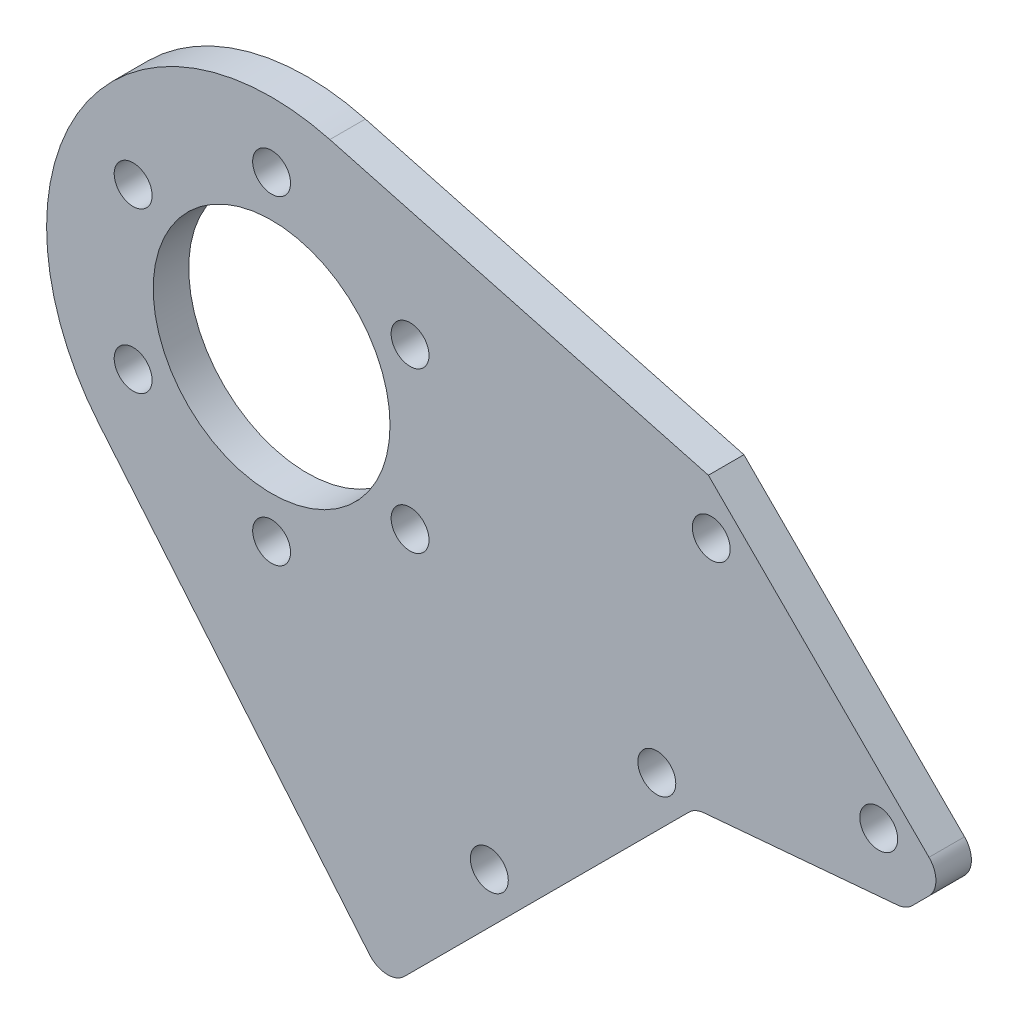
ISO-10303-21;
HEADER;
FILE_DESCRIPTION(('STEP AP214'),'2;1');
FILE_NAME('part.step','',(''),(''),'','','');
FILE_SCHEMA(('AUTOMOTIVE_DESIGN { 1 0 10303 214 1 1 1 1 }'));
ENDSEC;
DATA;
#1=APPLICATION_CONTEXT('core data for automotive mechanical design processes');
#2=APPLICATION_PROTOCOL_DEFINITION('international standard','automotive_design',2000,#1);
#3=PRODUCT_CONTEXT('',#1,'mechanical');
#4=PRODUCT('Part','Part','',(#3));
#5=PRODUCT_RELATED_PRODUCT_CATEGORY('part','',(#4));
#6=PRODUCT_DEFINITION_FORMATION('','',#4);
#7=PRODUCT_DEFINITION_CONTEXT('part definition',#1,'design');
#8=PRODUCT_DEFINITION('design','',#6,#7);
#9=PRODUCT_DEFINITION_SHAPE('','',#8);
#10=(LENGTH_UNIT() NAMED_UNIT(*) SI_UNIT(.MILLI.,.METRE.));
#11=(NAMED_UNIT(*) PLANE_ANGLE_UNIT() SI_UNIT($,.RADIAN.));
#12=(NAMED_UNIT(*) SI_UNIT($,.STERADIAN.) SOLID_ANGLE_UNIT());
#13=UNCERTAINTY_MEASURE_WITH_UNIT(LENGTH_MEASURE(1.E-05),#10,'distance_accuracy_value','');
#14=(GEOMETRIC_REPRESENTATION_CONTEXT(3) GLOBAL_UNCERTAINTY_ASSIGNED_CONTEXT((#13)) GLOBAL_UNIT_ASSIGNED_CONTEXT((#10,
#11,#12)) REPRESENTATION_CONTEXT('',''));
#15=CARTESIAN_POINT('',(0.,0.,0.));
#16=DIRECTION('',(0.,0.,1.));
#17=DIRECTION('',(1.,0.,0.));
#18=AXIS2_PLACEMENT_3D('',#15,#16,#17);
#19=CARTESIAN_POINT('',(0.,0.,3.));
#20=DIRECTION('',(0.,0.,1.));
#21=DIRECTION('',(1.,0.,0.));
#22=AXIS2_PLACEMENT_3D('',#19,#20,#21);
#23=PLANE('',#22);
#24=DIRECTION('',(0.965925826289065,-0.258819045102532,0.));
#25=VECTOR('',#24,1.);
#26=CARTESIAN_POINT('',(4.91756185694811,18.3525906994922,3.));
#27=LINE('',#26,#25);
#28=CARTESIAN_POINT('',(4.91756185694811,18.3525906994923,3.));
#29=VERTEX_POINT('',#28);
#30=CARTESIAN_POINT('',(36.8810468499901,9.78800070832194,3.));
#31=VERTEX_POINT('',#30);
#32=EDGE_CURVE('E121',#29,#31,#27,.T.);
#33=ORIENTED_EDGE('',*,*,#32,.F.);
#34=CARTESIAN_POINT('',(0.,0.,3.));
#35=DIRECTION('',(0.,0.,1.));
#36=DIRECTION('',(1.,0.,0.));
#37=AXIS2_PLACEMENT_3D('',#34,#35,#36);
#38=CIRCLE('',#37,19.);
#39=CARTESIAN_POINT('',(-14.5902375303274,-12.1706601632215,3.));
#40=VERTEX_POINT('',#39);
#41=EDGE_CURVE('E11',#29,#40,#38,.T.);
#42=ORIENTED_EDGE('',*,*,#41,.T.);
#43=DIRECTION('',(0.640561061222182,-0.767907238438284,0.));
#44=VECTOR('',#43,1.);
#45=CARTESIAN_POINT('',(8.26225110529954,-39.5663176609533,3.));
#46=LINE('',#45,#44);
#47=CARTESIAN_POINT('',(8.26225110529954,-39.5663176609533,3.));
#48=VERTEX_POINT('',#47);
#49=EDGE_CURVE('E144',#40,#48,#46,.T.);
#50=ORIENTED_EDGE('',*,*,#49,.T.);
#51=CARTESIAN_POINT('',(9.7980655821761,-38.285195538509,3.));
#52=DIRECTION('',(0.,0.,1.));
#53=DIRECTION('',(-1.,0.,0.));
#54=AXIS2_PLACEMENT_3D('',#51,#52,#53);
#55=CIRCLE('',#54,2.);
#56=CARTESIAN_POINT('',(11.2122791445492,-39.6994091008821,3.));
#57=VERTEX_POINT('',#56);
#58=EDGE_CURVE('E149',#48,#57,#55,.T.);
#59=ORIENTED_EDGE('',*,*,#58,.T.);
#60=DIRECTION('',(0.707106781186551,0.707106781186544,0.));
#61=VECTOR('',#60,1.);
#62=CARTESIAN_POINT('',(11.2122791445492,-39.6994091008821,3.));
#63=LINE('',#62,#61);
#64=CARTESIAN_POINT('',(35.2414614554186,-15.6702267900129,3.));
#65=VERTEX_POINT('',#64);
#66=EDGE_CURVE('E151',#57,#65,#63,.T.);
#67=ORIENTED_EDGE('',*,*,#66,.T.);
#68=CARTESIAN_POINT('',(36.6556750177917,-17.084440352386,3.));
#69=DIRECTION('',(0.,0.,-1.));
#70=DIRECTION('',(-1.,0.,0.));
#71=AXIS2_PLACEMENT_3D('',#68,#69,#70);
#72=CIRCLE('',#71,1.99999999999999);
#73=CARTESIAN_POINT('',(36.4813635322964,-15.0920509562025,3.));
#74=VERTEX_POINT('',#73);
#75=EDGE_CURVE('E159',#65,#74,#72,.T.);
#76=ORIENTED_EDGE('',*,*,#75,.T.);
#77=DIRECTION('',(0.996194698091746,0.0871557427476521,0.));
#78=VECTOR('',#77,1.);
#79=CARTESIAN_POINT('',(36.4813635322964,-15.0920509562025,3.));
#80=LINE('',#79,#78);
#81=CARTESIAN_POINT('',(52.853766683893,-13.6596512857618,3.));
#82=VERTEX_POINT('',#81);
#83=EDGE_CURVE('E162',#74,#82,#80,.T.);
#84=ORIENTED_EDGE('',*,*,#83,.T.);
#85=CARTESIAN_POINT('',(52.6794551983977,-11.6672618895783,3.));
#86=DIRECTION('',(0.,0.,1.));
#87=DIRECTION('',(-1.,0.,0.));
#88=AXIS2_PLACEMENT_3D('',#85,#86,#87);
#89=CIRCLE('',#88,2.);
#90=CARTESIAN_POINT('',(54.0936687607708,-13.0814754519514,3.));
#91=VERTEX_POINT('',#90);
#92=EDGE_CURVE('E165',#82,#91,#89,.T.);
#93=ORIENTED_EDGE('',*,*,#92,.T.);
#94=DIRECTION('',(0.707106781186551,0.707106781186544,0.));
#95=VECTOR('',#94,1.);
#96=CARTESIAN_POINT('',(55.5078823231439,-11.6672618895783,3.));
#97=LINE('',#96,#95);
#98=CARTESIAN_POINT('',(55.5078823231439,-11.6672618895783,3.));
#99=VERTEX_POINT('',#98);
#100=EDGE_CURVE('E168',#91,#99,#97,.T.);
#101=ORIENTED_EDGE('',*,*,#100,.T.);
#102=CARTESIAN_POINT('',(54.0936687607708,-10.2530483272052,3.));
#103=DIRECTION('',(0.,0.,1.));
#104=DIRECTION('',(-1.,0.,0.));
#105=AXIS2_PLACEMENT_3D('',#102,#103,#104);
#106=CIRCLE('',#105,2.);
#107=CARTESIAN_POINT('',(55.5078823231439,-8.83883476483214,3.));
#108=VERTEX_POINT('',#107);
#109=EDGE_CURVE('E153',#99,#108,#106,.T.);
#110=ORIENTED_EDGE('',*,*,#109,.T.);
#111=DIRECTION('',(-0.707106781186544,0.707106781186551,0.));
#112=VECTOR('',#111,1.);
#113=CARTESIAN_POINT('',(24.7487373415293,21.9203102167828,3.));
#114=LINE('',#113,#112);
#115=EDGE_CURVE('E126',#108,#31,#114,.T.);
#116=ORIENTED_EDGE('',*,*,#115,.T.);
#117=EDGE_LOOP('',(#33,#42,#50,#59,#67,#76,#84,#93,#101,#110,#116));
#118=FACE_BOUND('',#117,.T.);
#119=CARTESIAN_POINT('',(1.73860925656299E-13,-13.5,3.));
#120=DIRECTION('',(0.,0.,1.));
#121=DIRECTION('',(1.,0.,0.));
#122=AXIS2_PLACEMENT_3D('',#119,#120,#121);
#123=CIRCLE('',#122,1.6);
#124=CARTESIAN_POINT('',(1.60000000000017,-13.5,3.));
#125=VERTEX_POINT('',#124);
#126=EDGE_CURVE('E199',#125,#125,#123,.T.);
#127=ORIENTED_EDGE('',*,*,#126,.F.);
#128=EDGE_LOOP('',(#127));
#129=FACE_BOUND('',#128,.T.);
#130=CARTESIAN_POINT('',(11.6913429510899,6.75000000000004,3.));
#131=DIRECTION('',(0.,0.,1.));
#132=DIRECTION('',(1.,0.,0.));
#133=AXIS2_PLACEMENT_3D('',#130,#131,#132);
#134=CIRCLE('',#133,1.6);
#135=CARTESIAN_POINT('',(13.2913429510899,6.75000000000004,3.));
#136=VERTEX_POINT('',#135);
#137=EDGE_CURVE('E211',#136,#136,#134,.T.);
#138=ORIENTED_EDGE('',*,*,#137,.F.);
#139=EDGE_LOOP('',(#138));
#140=FACE_BOUND('',#139,.T.);
#141=CARTESIAN_POINT('',(0.,0.,3.));
#142=DIRECTION('',(0.,0.,1.));
#143=DIRECTION('',(1.,0.,0.));
#144=AXIS2_PLACEMENT_3D('',#141,#142,#143);
#145=CIRCLE('',#144,10.);
#146=CARTESIAN_POINT('',(10.,0.,3.));
#147=VERTEX_POINT('',#146);
#148=EDGE_CURVE('E223',#147,#147,#145,.T.);
#149=ORIENTED_EDGE('',*,*,#148,.F.);
#150=EDGE_LOOP('',(#149));
#151=FACE_BOUND('',#150,.T.);
#152=CARTESIAN_POINT('',(0.,13.5,3.));
#153=DIRECTION('',(0.,0.,1.));
#154=DIRECTION('',(1.,0.,0.));
#155=AXIS2_PLACEMENT_3D('',#152,#153,#154);
#156=CIRCLE('',#155,1.6);
#157=CARTESIAN_POINT('',(1.6,13.5,3.));
#158=VERTEX_POINT('',#157);
#159=EDGE_CURVE('E229',#158,#158,#156,.T.);
#160=ORIENTED_EDGE('',*,*,#159,.F.);
#161=EDGE_LOOP('',(#160));
#162=FACE_BOUND('',#161,.T.);
#163=CARTESIAN_POINT('',(-11.69134295109,-6.74999999999989,3.));
#164=DIRECTION('',(0.,0.,1.));
#165=DIRECTION('',(1.,0.,0.));
#166=AXIS2_PLACEMENT_3D('',#163,#164,#165);
#167=CIRCLE('',#166,1.6);
#168=CARTESIAN_POINT('',(-10.09134295109,-6.74999999999989,3.));
#169=VERTEX_POINT('',#168);
#170=EDGE_CURVE('E217',#169,#169,#167,.T.);
#171=ORIENTED_EDGE('',*,*,#170,.F.);
#172=EDGE_LOOP('',(#171));
#173=FACE_BOUND('',#172,.T.);
#174=CARTESIAN_POINT('',(11.6913429510899,-6.75,3.));
#175=DIRECTION('',(0.,0.,1.));
#176=DIRECTION('',(1.,0.,0.));
#177=AXIS2_PLACEMENT_3D('',#174,#175,#176);
#178=CIRCLE('',#177,1.60000000000045);
#179=CARTESIAN_POINT('',(13.2913429510904,-6.75,3.));
#180=VERTEX_POINT('',#179);
#181=EDGE_CURVE('E205',#180,#180,#178,.T.);
#182=ORIENTED_EDGE('',*,*,#181,.F.);
#183=EDGE_LOOP('',(#182));
#184=FACE_BOUND('',#183,.T.);
#185=CARTESIAN_POINT('',(-11.6913429510898,6.75000000000014,3.));
#186=DIRECTION('',(0.,0.,1.));
#187=DIRECTION('',(1.,0.,0.));
#188=AXIS2_PLACEMENT_3D('',#185,#186,#187);
#189=CIRCLE('',#188,1.6);
#190=CARTESIAN_POINT('',(-10.0913429510898,6.75000000000014,3.));
#191=VERTEX_POINT('',#190);
#192=EDGE_CURVE('E191',#191,#191,#189,.T.);
#193=ORIENTED_EDGE('',*,*,#192,.F.);
#194=EDGE_LOOP('',(#193));
#195=FACE_BOUND('',#194,.T.);
#196=CARTESIAN_POINT('',(18.38477631085,-28.2842712474621,3.));
#197=DIRECTION('',(0.,0.,1.));
#198=DIRECTION('',(1.,0.,0.));
#199=AXIS2_PLACEMENT_3D('',#196,#197,#198);
#200=CIRCLE('',#199,1.60000000000018);
#201=CARTESIAN_POINT('',(19.9847763108501,-28.2842712474621,3.));
#202=VERTEX_POINT('',#201);
#203=EDGE_CURVE('E280',#202,#202,#200,.T.);
#204=ORIENTED_EDGE('',*,*,#203,.F.);
#205=EDGE_LOOP('',(#204));
#206=FACE_BOUND('',#205,.T.);
#207=CARTESIAN_POINT('',(32.526911934581,-14.1421356237312,3.));
#208=DIRECTION('',(0.,0.,1.));
#209=DIRECTION('',(1.,0.,0.));
#210=AXIS2_PLACEMENT_3D('',#207,#208,#209);
#211=CIRCLE('',#210,1.60000000000019);
#212=CARTESIAN_POINT('',(34.1269119345812,-14.1421356237312,3.));
#213=VERTEX_POINT('',#212);
#214=EDGE_CURVE('E283',#213,#213,#211,.T.);
#215=ORIENTED_EDGE('',*,*,#214,.F.);
#216=EDGE_LOOP('',(#215));
#217=FACE_BOUND('',#216,.T.);
#218=CARTESIAN_POINT('',(37.1231060122938,5.30330085889891,3.));
#219=DIRECTION('',(0.,0.,1.));
#220=DIRECTION('',(1.,0.,0.));
#221=AXIS2_PLACEMENT_3D('',#218,#219,#220);
#222=CIRCLE('',#221,1.6);
#223=CARTESIAN_POINT('',(38.7231060122938,5.30330085889891,3.));
#224=VERTEX_POINT('',#223);
#225=EDGE_CURVE('E286',#224,#224,#222,.T.);
#226=ORIENTED_EDGE('',*,*,#225,.F.);
#227=EDGE_LOOP('',(#226));
#228=FACE_BOUND('',#227,.T.);
#229=CARTESIAN_POINT('',(51.2652416360247,-8.83883476483211,3.));
#230=DIRECTION('',(0.,0.,1.));
#231=DIRECTION('',(1.,0.,0.));
#232=AXIS2_PLACEMENT_3D('',#229,#230,#231);
#233=CIRCLE('',#232,1.59999999999998);
#234=CARTESIAN_POINT('',(52.8652416360246,-8.83883476483211,3.));
#235=VERTEX_POINT('',#234);
#236=EDGE_CURVE('E289',#235,#235,#233,.T.);
#237=ORIENTED_EDGE('',*,*,#236,.F.);
#238=EDGE_LOOP('',(#237));
#239=FACE_BOUND('',#238,.T.);
#240=ADVANCED_FACE('F41',(#118,#129,#140,#151,#162,#173,#184,#195,#206,#217,#228,#239),#23,.T.);
#241=CARTESIAN_POINT('',(0.,0.,0.));
#242=DIRECTION('',(0.,0.,1.));
#243=DIRECTION('',(1.,0.,0.));
#244=AXIS2_PLACEMENT_3D('',#241,#242,#243);
#245=PLANE('',#244);
#246=CARTESIAN_POINT('',(0.,0.,0.));
#247=DIRECTION('',(0.,0.,1.));
#248=DIRECTION('',(1.,0.,0.));
#249=AXIS2_PLACEMENT_3D('',#246,#247,#248);
#250=CIRCLE('',#249,19.);
#251=CARTESIAN_POINT('',(4.91756185694811,18.3525906994922,0.));
#252=VERTEX_POINT('',#251);
#253=CARTESIAN_POINT('',(-14.5902375303274,-12.1706601632215,0.));
#254=VERTEX_POINT('',#253);
#255=EDGE_CURVE('E45',#252,#254,#250,.T.);
#256=ORIENTED_EDGE('',*,*,#255,.F.);
#257=DIRECTION('',(0.965925826289065,-0.258819045102532,0.));
#258=VECTOR('',#257,1.);
#259=CARTESIAN_POINT('',(4.91756185694811,18.3525906994922,0.));
#260=LINE('',#259,#258);
#261=CARTESIAN_POINT('',(36.8810468499901,9.78800070832194,0.));
#262=VERTEX_POINT('',#261);
#263=EDGE_CURVE('E134',#252,#262,#260,.T.);
#264=ORIENTED_EDGE('',*,*,#263,.T.);
#265=DIRECTION('',(0.707106781186544,-0.707106781186551,0.));
#266=VECTOR('',#265,1.);
#267=CARTESIAN_POINT('',(24.7487373415293,21.9203102167828,0.));
#268=LINE('',#267,#266);
#269=CARTESIAN_POINT('',(55.5078823231439,-8.83883476483214,0.));
#270=VERTEX_POINT('',#269);
#271=EDGE_CURVE('E266',#262,#270,#268,.T.);
#272=ORIENTED_EDGE('',*,*,#271,.T.);
#273=CARTESIAN_POINT('',(54.0936687607708,-10.2530483272052,0.));
#274=DIRECTION('',(0.,0.,1.));
#275=DIRECTION('',(1.,0.,0.));
#276=AXIS2_PLACEMENT_3D('',#273,#274,#275);
#277=CIRCLE('',#276,2.);
#278=CARTESIAN_POINT('',(55.5078823231439,-11.6672618895783,0.));
#279=VERTEX_POINT('',#278);
#280=EDGE_CURVE('E278',#270,#279,#277,.F.);
#281=ORIENTED_EDGE('',*,*,#280,.T.);
#282=DIRECTION('',(-0.707106781186551,-0.707106781186544,0.));
#283=VECTOR('',#282,1.);
#284=CARTESIAN_POINT('',(55.5078823231439,-11.6672618895783,0.));
#285=LINE('',#284,#283);
#286=CARTESIAN_POINT('',(54.0936687607708,-13.0814754519514,0.));
#287=VERTEX_POINT('',#286);
#288=EDGE_CURVE('E276',#279,#287,#285,.T.);
#289=ORIENTED_EDGE('',*,*,#288,.T.);
#290=CARTESIAN_POINT('',(52.6794551983977,-11.6672618895783,0.));
#291=DIRECTION('',(0.,0.,1.));
#292=DIRECTION('',(1.,0.,0.));
#293=AXIS2_PLACEMENT_3D('',#290,#291,#292);
#294=CIRCLE('',#293,2.);
#295=CARTESIAN_POINT('',(52.853766683893,-13.6596512857618,0.));
#296=VERTEX_POINT('',#295);
#297=EDGE_CURVE('E274',#287,#296,#294,.F.);
#298=ORIENTED_EDGE('',*,*,#297,.T.);
#299=DIRECTION('',(-0.996194698091746,-0.0871557427476521,0.));
#300=VECTOR('',#299,1.);
#301=CARTESIAN_POINT('',(36.4813635322964,-15.0920509562025,0.));
#302=LINE('',#301,#300);
#303=CARTESIAN_POINT('',(36.4813635322964,-15.0920509562025,0.));
#304=VERTEX_POINT('',#303);
#305=EDGE_CURVE('E272',#296,#304,#302,.T.);
#306=ORIENTED_EDGE('',*,*,#305,.T.);
#307=CARTESIAN_POINT('',(36.6556750177917,-17.084440352386,0.));
#308=DIRECTION('',(0.,0.,1.));
#309=DIRECTION('',(1.,0.,0.));
#310=AXIS2_PLACEMENT_3D('',#307,#308,#309);
#311=CIRCLE('',#310,1.99999999999999);
#312=CARTESIAN_POINT('',(35.2414614554186,-15.6702267900129,0.));
#313=VERTEX_POINT('',#312);
#314=EDGE_CURVE('E270',#304,#313,#311,.T.);
#315=ORIENTED_EDGE('',*,*,#314,.T.);
#316=DIRECTION('',(-0.707106781186551,-0.707106781186544,0.));
#317=VECTOR('',#316,1.);
#318=CARTESIAN_POINT('',(11.2122791445492,-39.6994091008821,0.));
#319=LINE('',#318,#317);
#320=CARTESIAN_POINT('',(11.2122791445492,-39.6994091008821,0.));
#321=VERTEX_POINT('',#320);
#322=EDGE_CURVE('E263',#313,#321,#319,.T.);
#323=ORIENTED_EDGE('',*,*,#322,.T.);
#324=CARTESIAN_POINT('',(9.7980655821761,-38.285195538509,0.));
#325=DIRECTION('',(0.,0.,1.));
#326=DIRECTION('',(1.,0.,0.));
#327=AXIS2_PLACEMENT_3D('',#324,#325,#326);
#328=CIRCLE('',#327,2.);
#329=CARTESIAN_POINT('',(8.26225110529954,-39.5663176609533,0.));
#330=VERTEX_POINT('',#329);
#331=EDGE_CURVE('E261',#321,#330,#328,.F.);
#332=ORIENTED_EDGE('',*,*,#331,.T.);
#333=DIRECTION('',(-0.640561061222182,0.767907238438285,0.));
#334=VECTOR('',#333,1.);
#335=CARTESIAN_POINT('',(8.26225110529954,-39.5663176609533,0.));
#336=LINE('',#335,#334);
#337=EDGE_CURVE('E173',#330,#254,#336,.T.);
#338=ORIENTED_EDGE('',*,*,#337,.T.);
#339=EDGE_LOOP('',(#256,#264,#272,#281,#289,#298,#306,#315,#323,#332,#338));
#340=FACE_BOUND('',#339,.T.);
#341=CARTESIAN_POINT('',(0.,13.5,0.));
#342=DIRECTION('',(0.,0.,1.));
#343=DIRECTION('',(1.,0.,0.));
#344=AXIS2_PLACEMENT_3D('',#341,#342,#343);
#345=CIRCLE('',#344,1.6);
#346=CARTESIAN_POINT('',(1.6,13.5,0.));
#347=VERTEX_POINT('',#346);
#348=EDGE_CURVE('E226',#347,#347,#345,.T.);
#349=ORIENTED_EDGE('',*,*,#348,.T.);
#350=EDGE_LOOP('',(#349));
#351=FACE_BOUND('',#350,.T.);
#352=CARTESIAN_POINT('',(0.,0.,0.));
#353=DIRECTION('',(0.,0.,1.));
#354=DIRECTION('',(1.,0.,0.));
#355=AXIS2_PLACEMENT_3D('',#352,#353,#354);
#356=CIRCLE('',#355,10.);
#357=CARTESIAN_POINT('',(10.,0.,0.));
#358=VERTEX_POINT('',#357);
#359=EDGE_CURVE('E220',#358,#358,#356,.T.);
#360=ORIENTED_EDGE('',*,*,#359,.T.);
#361=EDGE_LOOP('',(#360));
#362=FACE_BOUND('',#361,.T.);
#363=CARTESIAN_POINT('',(-11.69134295109,-6.74999999999989,0.));
#364=DIRECTION('',(0.,0.,1.));
#365=DIRECTION('',(1.,0.,0.));
#366=AXIS2_PLACEMENT_3D('',#363,#364,#365);
#367=CIRCLE('',#366,1.6);
#368=CARTESIAN_POINT('',(-10.09134295109,-6.74999999999989,0.));
#369=VERTEX_POINT('',#368);
#370=EDGE_CURVE('E214',#369,#369,#367,.T.);
#371=ORIENTED_EDGE('',*,*,#370,.T.);
#372=EDGE_LOOP('',(#371));
#373=FACE_BOUND('',#372,.T.);
#374=CARTESIAN_POINT('',(11.6913429510899,6.75000000000004,0.));
#375=DIRECTION('',(0.,0.,1.));
#376=DIRECTION('',(1.,0.,0.));
#377=AXIS2_PLACEMENT_3D('',#374,#375,#376);
#378=CIRCLE('',#377,1.6);
#379=CARTESIAN_POINT('',(13.2913429510899,6.75000000000004,0.));
#380=VERTEX_POINT('',#379);
#381=EDGE_CURVE('E208',#380,#380,#378,.T.);
#382=ORIENTED_EDGE('',*,*,#381,.T.);
#383=EDGE_LOOP('',(#382));
#384=FACE_BOUND('',#383,.T.);
#385=CARTESIAN_POINT('',(11.6913429510899,-6.75,0.));
#386=DIRECTION('',(0.,0.,1.));
#387=DIRECTION('',(1.,0.,0.));
#388=AXIS2_PLACEMENT_3D('',#385,#386,#387);
#389=CIRCLE('',#388,1.60000000000045);
#390=CARTESIAN_POINT('',(13.2913429510904,-6.75,0.));
#391=VERTEX_POINT('',#390);
#392=EDGE_CURVE('E202',#391,#391,#389,.T.);
#393=ORIENTED_EDGE('',*,*,#392,.T.);
#394=EDGE_LOOP('',(#393));
#395=FACE_BOUND('',#394,.T.);
#396=CARTESIAN_POINT('',(1.73860925656299E-13,-13.5,0.));
#397=DIRECTION('',(0.,0.,1.));
#398=DIRECTION('',(1.,0.,0.));
#399=AXIS2_PLACEMENT_3D('',#396,#397,#398);
#400=CIRCLE('',#399,1.6);
#401=CARTESIAN_POINT('',(1.60000000000017,-13.5,0.));
#402=VERTEX_POINT('',#401);
#403=EDGE_CURVE('E194',#402,#402,#400,.T.);
#404=ORIENTED_EDGE('',*,*,#403,.T.);
#405=EDGE_LOOP('',(#404));
#406=FACE_BOUND('',#405,.T.);
#407=CARTESIAN_POINT('',(-11.6913429510898,6.75000000000014,0.));
#408=DIRECTION('',(0.,0.,1.));
#409=DIRECTION('',(1.,0.,0.));
#410=AXIS2_PLACEMENT_3D('',#407,#408,#409);
#411=CIRCLE('',#410,1.6);
#412=CARTESIAN_POINT('',(-10.0913429510898,6.75000000000014,0.));
#413=VERTEX_POINT('',#412);
#414=EDGE_CURVE('E195',#413,#413,#411,.T.);
#415=ORIENTED_EDGE('',*,*,#414,.T.);
#416=EDGE_LOOP('',(#415));
#417=FACE_BOUND('',#416,.T.);
#418=CARTESIAN_POINT('',(37.1231060122938,5.30330085889891,0.));
#419=DIRECTION('',(0.,0.,1.));
#420=DIRECTION('',(1.,0.,0.));
#421=AXIS2_PLACEMENT_3D('',#418,#419,#420);
#422=CIRCLE('',#421,1.6);
#423=CARTESIAN_POINT('',(38.7231060122938,5.30330085889891,0.));
#424=VERTEX_POINT('',#423);
#425=EDGE_CURVE('E190',#424,#424,#422,.F.);
#426=ORIENTED_EDGE('',*,*,#425,.F.);
#427=EDGE_LOOP('',(#426));
#428=FACE_BOUND('',#427,.T.);
#429=CARTESIAN_POINT('',(18.38477631085,-28.2842712474621,0.));
#430=DIRECTION('',(0.,0.,1.));
#431=DIRECTION('',(1.,0.,0.));
#432=AXIS2_PLACEMENT_3D('',#429,#430,#431);
#433=CIRCLE('',#432,1.60000000000018);
#434=CARTESIAN_POINT('',(19.9847763108501,-28.2842712474621,0.));
#435=VERTEX_POINT('',#434);
#436=EDGE_CURVE('E186',#435,#435,#433,.F.);
#437=ORIENTED_EDGE('',*,*,#436,.F.);
#438=EDGE_LOOP('',(#437));
#439=FACE_BOUND('',#438,.T.);
#440=CARTESIAN_POINT('',(32.526911934581,-14.1421356237312,0.));
#441=DIRECTION('',(0.,0.,1.));
#442=DIRECTION('',(1.,0.,0.));
#443=AXIS2_PLACEMENT_3D('',#440,#441,#442);
#444=CIRCLE('',#443,1.60000000000019);
#445=CARTESIAN_POINT('',(34.1269119345812,-14.1421356237312,0.));
#446=VERTEX_POINT('',#445);
#447=EDGE_CURVE('E189',#446,#446,#444,.F.);
#448=ORIENTED_EDGE('',*,*,#447,.F.);
#449=EDGE_LOOP('',(#448));
#450=FACE_BOUND('',#449,.T.);
#451=CARTESIAN_POINT('',(51.2652416360247,-8.83883476483211,0.));
#452=DIRECTION('',(0.,0.,1.));
#453=DIRECTION('',(1.,0.,0.));
#454=AXIS2_PLACEMENT_3D('',#451,#452,#453);
#455=CIRCLE('',#454,1.59999999999998);
#456=CARTESIAN_POINT('',(52.8652416360246,-8.83883476483211,0.));
#457=VERTEX_POINT('',#456);
#458=EDGE_CURVE('E198',#457,#457,#455,.F.);
#459=ORIENTED_EDGE('',*,*,#458,.F.);
#460=EDGE_LOOP('',(#459));
#461=FACE_BOUND('',#460,.T.);
#462=ADVANCED_FACE('F235',(#340,#351,#362,#373,#384,#395,#406,#417,#428,#439,#450,#461),#245,.F.);
#463=CARTESIAN_POINT('',(0.,0.,3.));
#464=DIRECTION('',(0.,0.,-1.));
#465=DIRECTION('',(-1.,0.,0.));
#466=AXIS2_PLACEMENT_3D('',#463,#464,#465);
#467=CYLINDRICAL_SURFACE('',#466,19.);
#468=ORIENTED_EDGE('',*,*,#41,.F.);
#469=DIRECTION('',(0.,0.,1.));
#470=VECTOR('',#469,1.);
#471=CARTESIAN_POINT('',(4.91756185694811,18.3525906994923,-11.6813930281425));
#472=LINE('',#471,#470);
#473=EDGE_CURVE('E130',#252,#29,#472,.T.);
#474=ORIENTED_EDGE('',*,*,#473,.F.);
#475=ORIENTED_EDGE('',*,*,#255,.T.);
#476=DIRECTION('',(0.,0.,1.));
#477=VECTOR('',#476,1.);
#478=CARTESIAN_POINT('',(-14.5902375303274,-12.1706601632215,-94.5460786274357));
#479=LINE('',#478,#477);
#480=EDGE_CURVE('E137',#254,#40,#479,.T.);
#481=ORIENTED_EDGE('',*,*,#480,.T.);
#482=EDGE_LOOP('',(#468,#474,#475,#481));
#483=FACE_BOUND('',#482,.T.);
#484=ADVANCED_FACE('F43',(#483),#467,.T.);
#485=CARTESIAN_POINT('',(0.,13.5,3.));
#486=DIRECTION('',(0.,0.,-1.));
#487=DIRECTION('',(-1.,0.,0.));
#488=AXIS2_PLACEMENT_3D('',#485,#486,#487);
#489=CYLINDRICAL_SURFACE('',#488,1.6);
#490=ORIENTED_EDGE('',*,*,#159,.T.);
#491=EDGE_LOOP('',(#490));
#492=FACE_BOUND('',#491,.T.);
#493=ORIENTED_EDGE('',*,*,#348,.F.);
#494=EDGE_LOOP('',(#493));
#495=FACE_BOUND('',#494,.T.);
#496=ADVANCED_FACE('F238',(#492,#495),#489,.F.);
#497=CARTESIAN_POINT('',(0.,0.,3.));
#498=DIRECTION('',(0.,0.,-1.));
#499=DIRECTION('',(-1.,0.,0.));
#500=AXIS2_PLACEMENT_3D('',#497,#498,#499);
#501=CYLINDRICAL_SURFACE('',#500,10.);
#502=ORIENTED_EDGE('',*,*,#148,.T.);
#503=EDGE_LOOP('',(#502));
#504=FACE_BOUND('',#503,.T.);
#505=ORIENTED_EDGE('',*,*,#359,.F.);
#506=EDGE_LOOP('',(#505));
#507=FACE_BOUND('',#506,.T.);
#508=ADVANCED_FACE('F240',(#504,#507),#501,.F.);
#509=CARTESIAN_POINT('',(-11.69134295109,-6.74999999999989,3.));
#510=DIRECTION('',(0.,0.,-1.));
#511=DIRECTION('',(-1.,0.,0.));
#512=AXIS2_PLACEMENT_3D('',#509,#510,#511);
#513=CYLINDRICAL_SURFACE('',#512,1.6);
#514=ORIENTED_EDGE('',*,*,#170,.T.);
#515=EDGE_LOOP('',(#514));
#516=FACE_BOUND('',#515,.T.);
#517=ORIENTED_EDGE('',*,*,#370,.F.);
#518=EDGE_LOOP('',(#517));
#519=FACE_BOUND('',#518,.T.);
#520=ADVANCED_FACE('F246',(#516,#519),#513,.F.);
#521=CARTESIAN_POINT('',(11.6913429510899,6.75000000000004,3.));
#522=DIRECTION('',(0.,0.,-1.));
#523=DIRECTION('',(-1.,0.,0.));
#524=AXIS2_PLACEMENT_3D('',#521,#522,#523);
#525=CYLINDRICAL_SURFACE('',#524,1.6);
#526=ORIENTED_EDGE('',*,*,#137,.T.);
#527=EDGE_LOOP('',(#526));
#528=FACE_BOUND('',#527,.T.);
#529=ORIENTED_EDGE('',*,*,#381,.F.);
#530=EDGE_LOOP('',(#529));
#531=FACE_BOUND('',#530,.T.);
#532=ADVANCED_FACE('F365',(#528,#531),#525,.F.);
#533=CARTESIAN_POINT('',(11.6913429510899,-6.75,3.));
#534=DIRECTION('',(0.,0.,-1.));
#535=DIRECTION('',(-1.,0.,0.));
#536=AXIS2_PLACEMENT_3D('',#533,#534,#535);
#537=CYLINDRICAL_SURFACE('',#536,1.60000000000045);
#538=ORIENTED_EDGE('',*,*,#181,.T.);
#539=EDGE_LOOP('',(#538));
#540=FACE_BOUND('',#539,.T.);
#541=ORIENTED_EDGE('',*,*,#392,.F.);
#542=EDGE_LOOP('',(#541));
#543=FACE_BOUND('',#542,.T.);
#544=ADVANCED_FACE('F361',(#540,#543),#537,.F.);
#545=CARTESIAN_POINT('',(1.73860925656299E-13,-13.5,3.));
#546=DIRECTION('',(0.,0.,-1.));
#547=DIRECTION('',(-1.,0.,0.));
#548=AXIS2_PLACEMENT_3D('',#545,#546,#547);
#549=CYLINDRICAL_SURFACE('',#548,1.6);
#550=ORIENTED_EDGE('',*,*,#126,.T.);
#551=EDGE_LOOP('',(#550));
#552=FACE_BOUND('',#551,.T.);
#553=ORIENTED_EDGE('',*,*,#403,.F.);
#554=EDGE_LOOP('',(#553));
#555=FACE_BOUND('',#554,.T.);
#556=ADVANCED_FACE('F357',(#552,#555),#549,.F.);
#557=CARTESIAN_POINT('',(-11.6913429510898,6.75000000000014,3.));
#558=DIRECTION('',(0.,0.,-1.));
#559=DIRECTION('',(-1.,0.,0.));
#560=AXIS2_PLACEMENT_3D('',#557,#558,#559);
#561=CYLINDRICAL_SURFACE('',#560,1.6);
#562=ORIENTED_EDGE('',*,*,#192,.T.);
#563=EDGE_LOOP('',(#562));
#564=FACE_BOUND('',#563,.T.);
#565=ORIENTED_EDGE('',*,*,#414,.F.);
#566=EDGE_LOOP('',(#565));
#567=FACE_BOUND('',#566,.T.);
#568=ADVANCED_FACE('F353',(#564,#567),#561,.F.);
#569=CARTESIAN_POINT('',(24.7487373415293,21.9203102167828,-94.5460786274357));
#570=DIRECTION('',(0.707106781186551,0.707106781186544,0.));
#571=DIRECTION('',(-0.707106781186544,0.707106781186551,0.));
#572=AXIS2_PLACEMENT_3D('',#569,#570,#571);
#573=PLANE('',#572);
#574=DIRECTION('',(0.,0.,1.));
#575=VECTOR('',#574,1.);
#576=CARTESIAN_POINT('',(36.8810468499901,9.78800070832194,-7.));
#577=LINE('',#576,#575);
#578=EDGE_CURVE('E129',#262,#31,#577,.T.);
#579=ORIENTED_EDGE('',*,*,#578,.T.);
#580=ORIENTED_EDGE('',*,*,#115,.F.);
#581=DIRECTION('',(0.,0.,1.));
#582=VECTOR('',#581,1.);
#583=CARTESIAN_POINT('',(55.5078823231439,-8.83883476483214,-94.5460786274357));
#584=LINE('',#583,#582);
#585=EDGE_CURVE('E142',#270,#108,#584,.T.);
#586=ORIENTED_EDGE('',*,*,#585,.F.);
#587=ORIENTED_EDGE('',*,*,#271,.F.);
#588=EDGE_LOOP('',(#579,#580,#586,#587));
#589=FACE_BOUND('',#588,.T.);
#590=ADVANCED_FACE('F299',(#589),#573,.T.);
#591=CARTESIAN_POINT('',(8.26225110529954,-39.5663176609533,-94.5460786274357));
#592=DIRECTION('',(-0.767907238438284,-0.640561061222182,0.));
#593=DIRECTION('',(0.640561061222182,-0.767907238438285,0.));
#594=AXIS2_PLACEMENT_3D('',#591,#592,#593);
#595=PLANE('',#594);
#596=ORIENTED_EDGE('',*,*,#337,.F.);
#597=DIRECTION('',(0.,0.,1.));
#598=VECTOR('',#597,1.);
#599=CARTESIAN_POINT('',(8.26225110529954,-39.5663176609533,-94.5460786274357));
#600=LINE('',#599,#598);
#601=EDGE_CURVE('E141',#330,#48,#600,.T.);
#602=ORIENTED_EDGE('',*,*,#601,.T.);
#603=ORIENTED_EDGE('',*,*,#49,.F.);
#604=ORIENTED_EDGE('',*,*,#480,.F.);
#605=EDGE_LOOP('',(#596,#602,#603,#604));
#606=FACE_BOUND('',#605,.T.);
#607=ADVANCED_FACE('F145',(#606),#595,.T.);
#608=CARTESIAN_POINT('',(9.7980655821761,-38.285195538509,-94.5460786274357));
#609=DIRECTION('',(0.,0.,1.));
#610=DIRECTION('',(1.,0.,0.));
#611=AXIS2_PLACEMENT_3D('',#608,#609,#610);
#612=CYLINDRICAL_SURFACE('',#611,2.);
#613=ORIENTED_EDGE('',*,*,#331,.F.);
#614=DIRECTION('',(0.,0.,1.));
#615=VECTOR('',#614,1.);
#616=CARTESIAN_POINT('',(11.2122791445492,-39.6994091008821,-94.5460786274357));
#617=LINE('',#616,#615);
#618=EDGE_CURVE('E182',#321,#57,#617,.T.);
#619=ORIENTED_EDGE('',*,*,#618,.T.);
#620=ORIENTED_EDGE('',*,*,#58,.F.);
#621=ORIENTED_EDGE('',*,*,#601,.F.);
#622=EDGE_LOOP('',(#613,#619,#620,#621));
#623=FACE_BOUND('',#622,.T.);
#624=ADVANCED_FACE('F346',(#623),#612,.T.);
#625=CARTESIAN_POINT('',(11.2122791445492,-39.6994091008821,-94.5460786274357));
#626=DIRECTION('',(0.707106781186544,-0.707106781186551,0.));
#627=DIRECTION('',(0.707106781186551,0.707106781186544,0.));
#628=AXIS2_PLACEMENT_3D('',#625,#626,#627);
#629=PLANE('',#628);
#630=ORIENTED_EDGE('',*,*,#322,.F.);
#631=DIRECTION('',(0.,0.,1.));
#632=VECTOR('',#631,1.);
#633=CARTESIAN_POINT('',(35.2414614554186,-15.6702267900129,-94.5460786274357));
#634=LINE('',#633,#632);
#635=EDGE_CURVE('E180',#313,#65,#634,.T.);
#636=ORIENTED_EDGE('',*,*,#635,.T.);
#637=ORIENTED_EDGE('',*,*,#66,.F.);
#638=ORIENTED_EDGE('',*,*,#618,.F.);
#639=EDGE_LOOP('',(#630,#636,#637,#638));
#640=FACE_BOUND('',#639,.T.);
#641=ADVANCED_FACE('F342',(#640),#629,.T.);
#642=CARTESIAN_POINT('',(36.6556750177917,-17.084440352386,-94.5460786274357));
#643=DIRECTION('',(0.,0.,1.));
#644=DIRECTION('',(1.,0.,0.));
#645=AXIS2_PLACEMENT_3D('',#642,#643,#644);
#646=CYLINDRICAL_SURFACE('',#645,1.99999999999999);
#647=ORIENTED_EDGE('',*,*,#314,.F.);
#648=DIRECTION('',(0.,0.,1.));
#649=VECTOR('',#648,1.);
#650=CARTESIAN_POINT('',(36.4813635322964,-15.0920509562025,-94.5460786274357));
#651=LINE('',#650,#649);
#652=EDGE_CURVE('E178',#304,#74,#651,.T.);
#653=ORIENTED_EDGE('',*,*,#652,.T.);
#654=ORIENTED_EDGE('',*,*,#75,.F.);
#655=ORIENTED_EDGE('',*,*,#635,.F.);
#656=EDGE_LOOP('',(#647,#653,#654,#655));
#657=FACE_BOUND('',#656,.T.);
#658=ADVANCED_FACE('F338',(#657),#646,.F.);
#659=CARTESIAN_POINT('',(36.4813635322964,-15.0920509562025,-94.5460786274357));
#660=DIRECTION('',(0.0871557427476521,-0.996194698091746,0.));
#661=DIRECTION('',(0.996194698091746,0.0871557427476521,0.));
#662=AXIS2_PLACEMENT_3D('',#659,#660,#661);
#663=PLANE('',#662);
#664=ORIENTED_EDGE('',*,*,#305,.F.);
#665=DIRECTION('',(0.,0.,1.));
#666=VECTOR('',#665,1.);
#667=CARTESIAN_POINT('',(52.853766683893,-13.6596512857618,-94.5460786274357));
#668=LINE('',#667,#666);
#669=EDGE_CURVE('E176',#296,#82,#668,.T.);
#670=ORIENTED_EDGE('',*,*,#669,.T.);
#671=ORIENTED_EDGE('',*,*,#83,.F.);
#672=ORIENTED_EDGE('',*,*,#652,.F.);
#673=EDGE_LOOP('',(#664,#670,#671,#672));
#674=FACE_BOUND('',#673,.T.);
#675=ADVANCED_FACE('F334',(#674),#663,.T.);
#676=CARTESIAN_POINT('',(52.6794551983977,-11.6672618895783,-94.5460786274357));
#677=DIRECTION('',(0.,0.,1.));
#678=DIRECTION('',(1.,0.,0.));
#679=AXIS2_PLACEMENT_3D('',#676,#677,#678);
#680=CYLINDRICAL_SURFACE('',#679,2.);
#681=ORIENTED_EDGE('',*,*,#297,.F.);
#682=DIRECTION('',(0.,0.,1.));
#683=VECTOR('',#682,1.);
#684=CARTESIAN_POINT('',(54.0936687607708,-13.0814754519514,-94.5460786274357));
#685=LINE('',#684,#683);
#686=EDGE_CURVE('E174',#287,#91,#685,.T.);
#687=ORIENTED_EDGE('',*,*,#686,.T.);
#688=ORIENTED_EDGE('',*,*,#92,.F.);
#689=ORIENTED_EDGE('',*,*,#669,.F.);
#690=EDGE_LOOP('',(#681,#687,#688,#689));
#691=FACE_BOUND('',#690,.T.);
#692=ADVANCED_FACE('F330',(#691),#680,.T.);
#693=CARTESIAN_POINT('',(55.5078823231439,-11.6672618895783,-94.5460786274357));
#694=DIRECTION('',(0.707106781186544,-0.707106781186551,0.));
#695=DIRECTION('',(0.707106781186551,0.707106781186544,0.));
#696=AXIS2_PLACEMENT_3D('',#693,#694,#695);
#697=PLANE('',#696);
#698=ORIENTED_EDGE('',*,*,#288,.F.);
#699=DIRECTION('',(0.,0.,1.));
#700=VECTOR('',#699,1.);
#701=CARTESIAN_POINT('',(55.5078823231439,-11.6672618895783,-94.5460786274357));
#702=LINE('',#701,#700);
#703=EDGE_CURVE('E171',#279,#99,#702,.T.);
#704=ORIENTED_EDGE('',*,*,#703,.T.);
#705=ORIENTED_EDGE('',*,*,#100,.F.);
#706=ORIENTED_EDGE('',*,*,#686,.F.);
#707=EDGE_LOOP('',(#698,#704,#705,#706));
#708=FACE_BOUND('',#707,.T.);
#709=ADVANCED_FACE('F324',(#708),#697,.T.);
#710=CARTESIAN_POINT('',(54.0936687607708,-10.2530483272052,-94.5460786274357));
#711=DIRECTION('',(0.,0.,1.));
#712=DIRECTION('',(1.,0.,0.));
#713=AXIS2_PLACEMENT_3D('',#710,#711,#712);
#714=CYLINDRICAL_SURFACE('',#713,2.);
#715=ORIENTED_EDGE('',*,*,#280,.F.);
#716=ORIENTED_EDGE('',*,*,#585,.T.);
#717=ORIENTED_EDGE('',*,*,#109,.F.);
#718=ORIENTED_EDGE('',*,*,#703,.F.);
#719=EDGE_LOOP('',(#715,#716,#717,#718));
#720=FACE_BOUND('',#719,.T.);
#721=ADVANCED_FACE('F296',(#720),#714,.T.);
#722=CARTESIAN_POINT('',(51.2652416360247,-8.83883476483211,-94.5460786274357));
#723=DIRECTION('',(0.,0.,1.));
#724=DIRECTION('',(1.,0.,0.));
#725=AXIS2_PLACEMENT_3D('',#722,#723,#724);
#726=CYLINDRICAL_SURFACE('',#725,1.59999999999998);
#727=ORIENTED_EDGE('',*,*,#458,.T.);
#728=EDGE_LOOP('',(#727));
#729=FACE_BOUND('',#728,.T.);
#730=ORIENTED_EDGE('',*,*,#236,.T.);
#731=EDGE_LOOP('',(#730));
#732=FACE_BOUND('',#731,.T.);
#733=ADVANCED_FACE('F309',(#729,#732),#726,.F.);
#734=CARTESIAN_POINT('',(37.1231060122938,5.30330085889891,-94.5460786274357));
#735=DIRECTION('',(0.,0.,1.));
#736=DIRECTION('',(1.,0.,0.));
#737=AXIS2_PLACEMENT_3D('',#734,#735,#736);
#738=CYLINDRICAL_SURFACE('',#737,1.6);
#739=ORIENTED_EDGE('',*,*,#425,.T.);
#740=EDGE_LOOP('',(#739));
#741=FACE_BOUND('',#740,.T.);
#742=ORIENTED_EDGE('',*,*,#225,.T.);
#743=EDGE_LOOP('',(#742));
#744=FACE_BOUND('',#743,.T.);
#745=ADVANCED_FACE('F313',(#741,#744),#738,.F.);
#746=CARTESIAN_POINT('',(32.526911934581,-14.1421356237312,-94.5460786274357));
#747=DIRECTION('',(0.,0.,1.));
#748=DIRECTION('',(1.,0.,0.));
#749=AXIS2_PLACEMENT_3D('',#746,#747,#748);
#750=CYLINDRICAL_SURFACE('',#749,1.60000000000019);
#751=ORIENTED_EDGE('',*,*,#447,.T.);
#752=EDGE_LOOP('',(#751));
#753=FACE_BOUND('',#752,.T.);
#754=ORIENTED_EDGE('',*,*,#214,.T.);
#755=EDGE_LOOP('',(#754));
#756=FACE_BOUND('',#755,.T.);
#757=ADVANCED_FACE('F321',(#753,#756),#750,.F.);
#758=CARTESIAN_POINT('',(18.38477631085,-28.2842712474621,-94.5460786274357));
#759=DIRECTION('',(0.,0.,1.));
#760=DIRECTION('',(1.,0.,0.));
#761=AXIS2_PLACEMENT_3D('',#758,#759,#760);
#762=CYLINDRICAL_SURFACE('',#761,1.60000000000018);
#763=ORIENTED_EDGE('',*,*,#436,.T.);
#764=EDGE_LOOP('',(#763));
#765=FACE_BOUND('',#764,.T.);
#766=ORIENTED_EDGE('',*,*,#203,.T.);
#767=EDGE_LOOP('',(#766));
#768=FACE_BOUND('',#767,.T.);
#769=ADVANCED_FACE('F395',(#765,#768),#762,.F.);
#770=CARTESIAN_POINT('',(4.91756185694811,18.3525906994922,-7.));
#771=DIRECTION('',(-0.258819045102532,-0.965925826289065,0.));
#772=DIRECTION('',(0.965925826289065,-0.258819045102532,0.));
#773=AXIS2_PLACEMENT_3D('',#770,#771,#772);
#774=PLANE('',#773);
#775=ORIENTED_EDGE('',*,*,#263,.F.);
#776=ORIENTED_EDGE('',*,*,#473,.T.);
#777=ORIENTED_EDGE('',*,*,#32,.T.);
#778=ORIENTED_EDGE('',*,*,#578,.F.);
#779=EDGE_LOOP('',(#775,#776,#777,#778));
#780=FACE_BOUND('',#779,.T.);
#781=ADVANCED_FACE('F132',(#780),#774,.F.);
#782=CLOSED_SHELL('',(#240,#462,#484,#496,#508,#520,#532,#544,#556,#568,#590,#607,#624,#641,
#658,#675,#692,#709,#721,#733,#745,#757,#769,#781));
#783=MANIFOLD_SOLID_BREP('B2',#782);
#784=ADVANCED_BREP_SHAPE_REPRESENTATION('',(#18,#783),#14);
#785=SHAPE_DEFINITION_REPRESENTATION(#9,#784);
ENDSEC;
END-ISO-10303-21;
